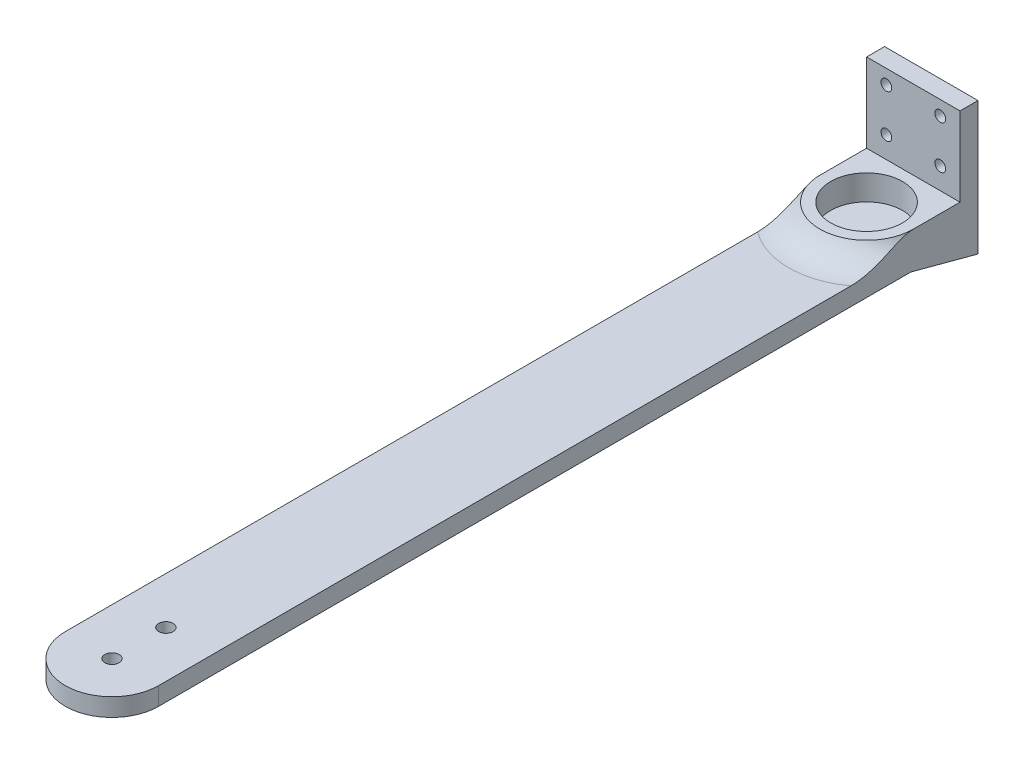
ISO-10303-21;
HEADER;
FILE_DESCRIPTION(('STEP AP214'),'2;1');
FILE_NAME('part.step','',(''),(''),'','','');
FILE_SCHEMA(('AUTOMOTIVE_DESIGN { 1 0 10303 214 1 1 1 1 }'));
ENDSEC;
DATA;
#1=APPLICATION_CONTEXT('core data for automotive mechanical design processes');
#2=APPLICATION_PROTOCOL_DEFINITION('international standard','automotive_design',2000,#1);
#3=PRODUCT_CONTEXT('',#1,'mechanical');
#4=PRODUCT('Part','Part','',(#3));
#5=PRODUCT_RELATED_PRODUCT_CATEGORY('part','',(#4));
#6=PRODUCT_DEFINITION_FORMATION('','',#4);
#7=PRODUCT_DEFINITION_CONTEXT('part definition',#1,'design');
#8=PRODUCT_DEFINITION('design','',#6,#7);
#9=PRODUCT_DEFINITION_SHAPE('','',#8);
#10=(LENGTH_UNIT() NAMED_UNIT(*) SI_UNIT(.MILLI.,.METRE.));
#11=(NAMED_UNIT(*) PLANE_ANGLE_UNIT() SI_UNIT($,.RADIAN.));
#12=(NAMED_UNIT(*) SI_UNIT($,.STERADIAN.) SOLID_ANGLE_UNIT());
#13=UNCERTAINTY_MEASURE_WITH_UNIT(LENGTH_MEASURE(1.E-05),#10,'distance_accuracy_value','');
#14=(GEOMETRIC_REPRESENTATION_CONTEXT(3) GLOBAL_UNCERTAINTY_ASSIGNED_CONTEXT((#13)) GLOBAL_UNIT_ASSIGNED_CONTEXT((#10,
#11,#12)) REPRESENTATION_CONTEXT('',''));
#15=CARTESIAN_POINT('',(0.,0.,0.));
#16=DIRECTION('',(0.,0.,1.));
#17=DIRECTION('',(1.,0.,0.));
#18=AXIS2_PLACEMENT_3D('',#15,#16,#17);
#19=CARTESIAN_POINT('',(0.,0.,0.));
#20=DIRECTION('',(0.,1.,0.));
#21=DIRECTION('',(0.,0.,1.));
#22=AXIS2_PLACEMENT_3D('',#19,#20,#21);
#23=PLANE('',#22);
#24=CARTESIAN_POINT('',(0.,0.,210.));
#25=DIRECTION('',(0.,-1.,0.));
#26=DIRECTION('',(0.,0.,-1.));
#27=AXIS2_PLACEMENT_3D('',#24,#25,#26);
#28=CIRCLE('',#27,2.);
#29=CARTESIAN_POINT('',(0.,0.,208.));
#30=VERTEX_POINT('',#29);
#31=EDGE_CURVE('E186',#30,#30,#28,.T.);
#32=ORIENTED_EDGE('',*,*,#31,.F.);
#33=EDGE_LOOP('',(#32));
#34=FACE_BOUND('',#33,.T.);
#35=CARTESIAN_POINT('',(0.,0.,195.));
#36=DIRECTION('',(0.,-1.,0.));
#37=DIRECTION('',(0.,0.,-1.));
#38=AXIS2_PLACEMENT_3D('',#35,#36,#37);
#39=CIRCLE('',#38,2.);
#40=CARTESIAN_POINT('',(0.,0.,193.));
#41=VERTEX_POINT('',#40);
#42=EDGE_CURVE('E167',#41,#41,#39,.T.);
#43=ORIENTED_EDGE('',*,*,#42,.F.);
#44=EDGE_LOOP('',(#43));
#45=FACE_BOUND('',#44,.T.);
#46=DIRECTION('',(-1.,0.,0.));
#47=VECTOR('',#46,1.);
#48=CARTESIAN_POINT('',(32.3185165257813,0.,0.66025403784432));
#49=LINE('',#48,#47);
#50=CARTESIAN_POINT('',(13.,0.,0.66025403784432));
#51=VERTEX_POINT('',#50);
#52=CARTESIAN_POINT('',(-13.,0.,0.66025403784432));
#53=VERTEX_POINT('',#52);
#54=EDGE_CURVE('E68',#51,#53,#49,.T.);
#55=ORIENTED_EDGE('',*,*,#54,.F.);
#56=DIRECTION('',(0.,0.,1.));
#57=VECTOR('',#56,1.);
#58=CARTESIAN_POINT('',(13.,0.,0.));
#59=LINE('',#58,#57);
#60=CARTESIAN_POINT('',(13.,0.,210.));
#61=VERTEX_POINT('',#60);
#62=EDGE_CURVE('E137',#51,#61,#59,.T.);
#63=ORIENTED_EDGE('',*,*,#62,.T.);
#64=CARTESIAN_POINT('',(0.,0.,210.));
#65=DIRECTION('',(0.,-1.,0.));
#66=DIRECTION('',(0.,0.,-1.));
#67=AXIS2_PLACEMENT_3D('',#64,#65,#66);
#68=CIRCLE('',#67,13.);
#69=CARTESIAN_POINT('',(-13.,0.,210.));
#70=VERTEX_POINT('',#69);
#71=EDGE_CURVE('E195',#70,#61,#68,.F.);
#72=ORIENTED_EDGE('',*,*,#71,.F.);
#73=DIRECTION('',(0.,0.,1.));
#74=VECTOR('',#73,1.);
#75=CARTESIAN_POINT('',(-13.,0.,0.));
#76=LINE('',#75,#74);
#77=EDGE_CURVE('E194',#53,#70,#76,.T.);
#78=ORIENTED_EDGE('',*,*,#77,.F.);
#79=EDGE_LOOP('',(#55,#63,#72,#78));
#80=FACE_BOUND('',#79,.T.);
#81=ADVANCED_FACE('F50',(#34,#45,#80),#23,.F.);
#82=CARTESIAN_POINT('',(0.,10.,0.));
#83=DIRECTION('',(0.,-1.,0.));
#84=DIRECTION('',(0.,0.,-1.));
#85=AXIS2_PLACEMENT_3D('',#82,#83,#84);
#86=CYLINDRICAL_SURFACE('',#85,10.);
#87=CARTESIAN_POINT('',(0.,3.,0.));
#88=DIRECTION('',(0.,1.,0.));
#89=DIRECTION('',(0.,0.,1.));
#90=AXIS2_PLACEMENT_3D('',#87,#88,#89);
#91=CIRCLE('',#90,10.);
#92=CARTESIAN_POINT('',(0.,3.,10.));
#93=VERTEX_POINT('',#92);
#94=EDGE_CURVE('E210',#93,#93,#91,.T.);
#95=ORIENTED_EDGE('',*,*,#94,.F.);
#96=EDGE_LOOP('',(#95));
#97=FACE_BOUND('',#96,.T.);
#98=CARTESIAN_POINT('',(0.,10.,0.));
#99=DIRECTION('',(0.,1.,0.));
#100=DIRECTION('',(0.,0.,1.));
#101=AXIS2_PLACEMENT_3D('',#98,#99,#100);
#102=CIRCLE('',#101,10.);
#103=CARTESIAN_POINT('',(0.,10.,10.));
#104=VERTEX_POINT('',#103);
#105=EDGE_CURVE('E204',#104,#104,#102,.T.);
#106=ORIENTED_EDGE('',*,*,#105,.T.);
#107=EDGE_LOOP('',(#106));
#108=FACE_BOUND('',#107,.T.);
#109=ADVANCED_FACE('F243',(#97,#108),#86,.F.);
#110=CARTESIAN_POINT('',(0.,10.,0.));
#111=DIRECTION('',(0.,1.,0.));
#112=DIRECTION('',(0.,0.,1.));
#113=AXIS2_PLACEMENT_3D('',#110,#111,#112);
#114=PLANE('',#113);
#115=CARTESIAN_POINT('',(0.,10.,0.));
#116=DIRECTION('',(0.,1.,0.));
#117=DIRECTION('',(0.,0.,1.));
#118=AXIS2_PLACEMENT_3D('',#115,#116,#117);
#119=CIRCLE('',#118,13.);
#120=CARTESIAN_POINT('',(-13.,10.,0.));
#121=VERTEX_POINT('',#120);
#122=CARTESIAN_POINT('',(13.,10.,0.));
#123=VERTEX_POINT('',#122);
#124=EDGE_CURVE('E199',#121,#123,#119,.T.);
#125=ORIENTED_EDGE('',*,*,#124,.T.);
#126=DIRECTION('',(0.,0.,-1.));
#127=VECTOR('',#126,1.);
#128=CARTESIAN_POINT('',(13.,10.,223.001));
#129=LINE('',#128,#127);
#130=CARTESIAN_POINT('',(13.,10.,-13.));
#131=VERTEX_POINT('',#130);
#132=EDGE_CURVE('E170',#123,#131,#129,.T.);
#133=ORIENTED_EDGE('',*,*,#132,.T.);
#134=DIRECTION('',(-1.,0.,0.));
#135=VECTOR('',#134,1.);
#136=CARTESIAN_POINT('',(13.,10.,-13.));
#137=LINE('',#136,#135);
#138=CARTESIAN_POINT('',(-13.,10.,-13.));
#139=VERTEX_POINT('',#138);
#140=EDGE_CURVE('E166',#131,#139,#137,.T.);
#141=ORIENTED_EDGE('',*,*,#140,.T.);
#142=DIRECTION('',(0.,0.,-1.));
#143=VECTOR('',#142,1.);
#144=CARTESIAN_POINT('',(-13.,10.,223.001));
#145=LINE('',#144,#143);
#146=EDGE_CURVE('E151',#121,#139,#145,.T.);
#147=ORIENTED_EDGE('',*,*,#146,.F.);
#148=EDGE_LOOP('',(#125,#133,#141,#147));
#149=FACE_BOUND('',#148,.T.);
#150=ORIENTED_EDGE('',*,*,#105,.F.);
#151=EDGE_LOOP('',(#150));
#152=FACE_BOUND('',#151,.T.);
#153=ADVANCED_FACE('F237',(#149,#152),#114,.T.);
#154=CARTESIAN_POINT('',(0.,3.,0.));
#155=DIRECTION('',(0.,1.,0.));
#156=DIRECTION('',(0.,0.,1.));
#157=AXIS2_PLACEMENT_3D('',#154,#155,#156);
#158=PLANE('',#157);
#159=ORIENTED_EDGE('',*,*,#94,.T.);
#160=EDGE_LOOP('',(#159));
#161=FACE_BOUND('',#160,.T.);
#162=ADVANCED_FACE('F226',(#161),#158,.T.);
#163=CARTESIAN_POINT('',(0.,5.,210.));
#164=DIRECTION('',(0.,-1.,0.));
#165=DIRECTION('',(0.,0.,-1.));
#166=AXIS2_PLACEMENT_3D('',#163,#164,#165);
#167=CYLINDRICAL_SURFACE('',#166,13.);
#168=ORIENTED_EDGE('',*,*,#71,.T.);
#169=DIRECTION('',(0.,-1.,0.));
#170=VECTOR('',#169,1.);
#171=CARTESIAN_POINT('',(13.,5.,210.));
#172=LINE('',#171,#170);
#173=CARTESIAN_POINT('',(13.,5.,210.));
#174=VERTEX_POINT('',#173);
#175=EDGE_CURVE('E198',#174,#61,#172,.T.);
#176=ORIENTED_EDGE('',*,*,#175,.F.);
#177=CARTESIAN_POINT('',(0.,5.,210.));
#178=DIRECTION('',(0.,-1.,0.));
#179=DIRECTION('',(0.,0.,-1.));
#180=AXIS2_PLACEMENT_3D('',#177,#178,#179);
#181=CIRCLE('',#180,13.);
#182=CARTESIAN_POINT('',(-13.,5.,210.));
#183=VERTEX_POINT('',#182);
#184=EDGE_CURVE('E177',#183,#174,#181,.F.);
#185=ORIENTED_EDGE('',*,*,#184,.F.);
#186=DIRECTION('',(0.,-1.,0.));
#187=VECTOR('',#186,1.);
#188=CARTESIAN_POINT('',(-13.,5.,210.));
#189=LINE('',#188,#187);
#190=EDGE_CURVE('E187',#183,#70,#189,.T.);
#191=ORIENTED_EDGE('',*,*,#190,.T.);
#192=EDGE_LOOP('',(#168,#176,#185,#191));
#193=FACE_BOUND('',#192,.T.);
#194=ADVANCED_FACE('F222',(#193),#167,.T.);
#195=CARTESIAN_POINT('',(13.,5.,0.));
#196=DIRECTION('',(1.,0.,0.));
#197=DIRECTION('',(0.,0.,-1.));
#198=AXIS2_PLACEMENT_3D('',#195,#196,#197);
#199=PLANE('',#198);
#200=ORIENTED_EDGE('',*,*,#62,.F.);
#201=DIRECTION('',(0.,0.258819045102522,0.965925826289068));
#202=VECTOR('',#201,1.);
#203=CARTESIAN_POINT('',(13.,-5.,-18.));
#204=LINE('',#203,#202);
#205=CARTESIAN_POINT('',(13.,-5.,-18.));
#206=VERTEX_POINT('',#205);
#207=EDGE_CURVE('E140',#206,#51,#204,.T.);
#208=ORIENTED_EDGE('',*,*,#207,.F.);
#209=DIRECTION('',(0.,-1.,0.));
#210=VECTOR('',#209,1.);
#211=CARTESIAN_POINT('',(13.,0.,-18.));
#212=LINE('',#211,#210);
#213=CARTESIAN_POINT('',(13.,32.,-18.));
#214=VERTEX_POINT('',#213);
#215=EDGE_CURVE('E124',#214,#206,#212,.T.);
#216=ORIENTED_EDGE('',*,*,#215,.F.);
#217=DIRECTION('',(0.,0.,1.));
#218=VECTOR('',#217,1.);
#219=CARTESIAN_POINT('',(13.,32.,-18.));
#220=LINE('',#219,#218);
#221=CARTESIAN_POINT('',(13.,32.,-13.));
#222=VERTEX_POINT('',#221);
#223=EDGE_CURVE('E132',#214,#222,#220,.T.);
#224=ORIENTED_EDGE('',*,*,#223,.T.);
#225=DIRECTION('',(0.,-1.,0.));
#226=VECTOR('',#225,1.);
#227=CARTESIAN_POINT('',(13.,0.,-13.));
#228=LINE('',#227,#226);
#229=EDGE_CURVE('E158',#222,#131,#228,.T.);
#230=ORIENTED_EDGE('',*,*,#229,.T.);
#231=ORIENTED_EDGE('',*,*,#132,.F.);
#232=CARTESIAN_POINT('',(13.,10.,0.));
#233=CARTESIAN_POINT('',(13.,10.0000056019238,0.0896543509538901));
#234=CARTESIAN_POINT('',(13.,9.99839286840601,0.179300659693812));
#235=CARTESIAN_POINT('',(13.,9.99198153676725,0.358470745976763));
#236=CARTESIAN_POINT('',(13.,9.98718325147842,0.447994534686714));
#237=CARTESIAN_POINT('',(13.,9.96810306155521,0.716006153465018));
#238=CARTESIAN_POINT('',(13.,9.94913555159317,0.89417812995479));
#239=CARTESIAN_POINT('',(13.,9.89993574508726,1.24703368869215));
#240=CARTESIAN_POINT('',(13.,9.86982232068042,1.42173428523119));
#241=CARTESIAN_POINT('',(13.,9.79966665096586,1.76916307890243));
#242=CARTESIAN_POINT('',(13.,9.75962139468372,1.94189066124571));
#243=CARTESIAN_POINT('',(13.,9.67114674603718,2.2851000656238));
#244=CARTESIAN_POINT('',(13.,9.62272002349056,2.45558258424519));
#245=CARTESIAN_POINT('',(13.,9.51898545195341,2.79441174070556));
#246=CARTESIAN_POINT('',(13.,9.46367794134916,2.96275848313031));
#247=CARTESIAN_POINT('',(13.,9.34734907713014,3.29816517676183));
#248=CARTESIAN_POINT('',(13.,9.28630687786827,3.46521784032122));
#249=CARTESIAN_POINT('',(13.,9.15992379563443,3.79766977095107));
#250=CARTESIAN_POINT('',(13.,9.09458309478465,3.96306910772934));
#251=CARTESIAN_POINT('',(13.,8.91970451683082,4.39337581793867));
#252=CARTESIAN_POINT('',(13.,8.80759145495182,4.65723128559471));
#253=CARTESIAN_POINT('',(13.,8.57864025012165,5.18289258169075));
#254=CARTESIAN_POINT('',(13.,8.46180151704577,5.44469814924396));
#255=CARTESIAN_POINT('',(13.,8.22618069776955,5.96753807011292));
#256=CARTESIAN_POINT('',(13.,8.10739795015014,6.22857212370811));
#257=CARTESIAN_POINT('',(13.,7.87018598281517,6.75078523519494));
#258=CARTESIAN_POINT('',(13.,7.7517567453596,7.01196428500284));
#259=CARTESIAN_POINT('',(13.,7.51763801680784,7.53410267287928));
#260=CARTESIAN_POINT('',(13.,7.40193838375753,7.79505743511656));
#261=CARTESIAN_POINT('',(13.,7.17427119116873,8.31859961060457));
#262=CARTESIAN_POINT('',(13.,7.06230366297831,8.58118703754699));
#263=CARTESIAN_POINT('',(13.,6.84347058344136,9.10850455587691));
#264=CARTESIAN_POINT('',(13.,6.73660523276951,9.37323473106309));
#265=CARTESIAN_POINT('',(13.,6.52923074056898,9.90517087318102));
#266=CARTESIAN_POINT('',(13.,6.42872161762033,10.1723768473472));
#267=CARTESIAN_POINT('',(13.,6.13551044473197,10.9863594340849));
#268=CARTESIAN_POINT('',(13.,5.95454543989271,11.5374601927441));
#269=CARTESIAN_POINT('',(13.,5.63285274538641,12.6511146702757));
#270=CARTESIAN_POINT('',(13.,5.49209516782712,13.2136595472762));
#271=CARTESIAN_POINT('',(13.,5.31592878251318,14.0720854299519));
#272=CARTESIAN_POINT('',(13.,5.26260692965661,14.3643385340628));
#273=CARTESIAN_POINT('',(13.,5.16982240181715,14.9510292891363));
#274=CARTESIAN_POINT('',(13.,5.13035814478151,15.2454666868074));
#275=CARTESIAN_POINT('',(13.,5.06625451302861,15.8369470451726));
#276=CARTESIAN_POINT('',(13.,5.04166411309216,16.133995381061));
#277=CARTESIAN_POINT('',(13.,5.0085284866831,16.7291144349595));
#278=CARTESIAN_POINT('',(13.,4.99999067592787,17.027185561795));
#279=CARTESIAN_POINT('',(13.,5.,17.3253168797559));
#280=B_SPLINE_CURVE_WITH_KNOTS('',3,(#232,#233,#234,#235,#236,#237,#238,#239,#240,#241,#242,
#243,#244,#245,#246,#247,#248,#249,#250,#251,#252,#253,#254,#255,#256,#257,#258,#259,#260,#261,
#262,#263,#264,#265,#266,#267,#268,#269,#270,#271,#272,#273,#274,#275,#276,#277,#278,#279),
.UNSPECIFIED.,.F.,.F.,(4,2,2,2,2,2,2,2,2,2,2,2,2,2,2,2,2,2,2,2,2,2,2,4),(0.,0.26893317208374,
0.537839937907302,1.07492345709711,1.60643665576927,2.13811118752676,2.66961667125123,
3.2010960267002,3.73458814556347,4.26805767556552,5.12801830534511,5.98808665747486,
6.84845398166465,7.7087773791334,8.56511973859628,9.42146928915171,10.2778524932503,
11.1342382005472,12.8731903009987,14.6108463803658,15.5018008230113,16.392653516726,
17.2864237537457,18.180606779037),.UNSPECIFIED.);
#281=CARTESIAN_POINT('',(13.,5.,17.3253168797559));
#282=VERTEX_POINT('',#281);
#283=EDGE_CURVE('E11',#123,#282,#280,.T.);
#284=ORIENTED_EDGE('',*,*,#283,.T.);
#285=DIRECTION('',(0.,0.,1.));
#286=VECTOR('',#285,1.);
#287=CARTESIAN_POINT('',(13.,5.,0.));
#288=LINE('',#287,#286);
#289=EDGE_CURVE('E183',#282,#174,#288,.T.);
#290=ORIENTED_EDGE('',*,*,#289,.T.);
#291=ORIENTED_EDGE('',*,*,#175,.T.);
#292=EDGE_LOOP('',(#200,#208,#216,#224,#230,#231,#284,#290,#291));
#293=FACE_BOUND('',#292,.T.);
#294=ADVANCED_FACE('F136',(#293),#199,.T.);
#295=CARTESIAN_POINT('',(0.,5.,210.));
#296=DIRECTION('',(0.,-1.,0.));
#297=DIRECTION('',(0.,0.,-1.));
#298=AXIS2_PLACEMENT_3D('',#295,#296,#297);
#299=CYLINDRICAL_SURFACE('',#298,2.);
#300=CARTESIAN_POINT('',(0.,5.,210.));
#301=DIRECTION('',(0.,-1.,0.));
#302=DIRECTION('',(0.,0.,-1.));
#303=AXIS2_PLACEMENT_3D('',#300,#301,#302);
#304=CIRCLE('',#303,2.);
#305=CARTESIAN_POINT('',(0.,5.,208.));
#306=VERTEX_POINT('',#305);
#307=EDGE_CURVE('E176',#306,#306,#304,.T.);
#308=ORIENTED_EDGE('',*,*,#307,.F.);
#309=EDGE_LOOP('',(#308));
#310=FACE_BOUND('',#309,.T.);
#311=ORIENTED_EDGE('',*,*,#31,.T.);
#312=EDGE_LOOP('',(#311));
#313=FACE_BOUND('',#312,.T.);
#314=ADVANCED_FACE('F229',(#310,#313),#299,.F.);
#315=CARTESIAN_POINT('',(0.,5.,195.));
#316=DIRECTION('',(0.,-1.,0.));
#317=DIRECTION('',(0.,0.,-1.));
#318=AXIS2_PLACEMENT_3D('',#315,#316,#317);
#319=CYLINDRICAL_SURFACE('',#318,2.);
#320=CARTESIAN_POINT('',(0.,5.,195.));
#321=DIRECTION('',(0.,-1.,0.));
#322=DIRECTION('',(0.,0.,-1.));
#323=AXIS2_PLACEMENT_3D('',#320,#321,#322);
#324=CIRCLE('',#323,2.);
#325=CARTESIAN_POINT('',(0.,5.,193.));
#326=VERTEX_POINT('',#325);
#327=EDGE_CURVE('E173',#326,#326,#324,.T.);
#328=ORIENTED_EDGE('',*,*,#327,.F.);
#329=EDGE_LOOP('',(#328));
#330=FACE_BOUND('',#329,.T.);
#331=ORIENTED_EDGE('',*,*,#42,.T.);
#332=EDGE_LOOP('',(#331));
#333=FACE_BOUND('',#332,.T.);
#334=ADVANCED_FACE('F225',(#330,#333),#319,.F.);
#335=CARTESIAN_POINT('',(-13.,5.,0.));
#336=DIRECTION('',(1.,0.,0.));
#337=DIRECTION('',(0.,0.,-1.));
#338=AXIS2_PLACEMENT_3D('',#335,#336,#337);
#339=PLANE('',#338);
#340=DIRECTION('',(0.,1.,0.));
#341=VECTOR('',#340,1.);
#342=CARTESIAN_POINT('',(-13.,0.,-18.));
#343=LINE('',#342,#341);
#344=CARTESIAN_POINT('',(-13.,-5.,-18.));
#345=VERTEX_POINT('',#344);
#346=CARTESIAN_POINT('',(-13.,32.,-18.));
#347=VERTEX_POINT('',#346);
#348=EDGE_CURVE('E152',#345,#347,#343,.T.);
#349=ORIENTED_EDGE('',*,*,#348,.F.);
#350=DIRECTION('',(0.,0.258819045102522,0.965925826289068));
#351=VECTOR('',#350,1.);
#352=CARTESIAN_POINT('',(-13.,-5.,-18.));
#353=LINE('',#352,#351);
#354=EDGE_CURVE('E143',#345,#53,#353,.T.);
#355=ORIENTED_EDGE('',*,*,#354,.T.);
#356=ORIENTED_EDGE('',*,*,#77,.T.);
#357=ORIENTED_EDGE('',*,*,#190,.F.);
#358=DIRECTION('',(0.,0.,1.));
#359=VECTOR('',#358,1.);
#360=CARTESIAN_POINT('',(-13.,5.,0.));
#361=LINE('',#360,#359);
#362=CARTESIAN_POINT('',(-13.,5.,17.3253168797559));
#363=VERTEX_POINT('',#362);
#364=EDGE_CURVE('E185',#363,#183,#361,.T.);
#365=ORIENTED_EDGE('',*,*,#364,.F.);
#366=CARTESIAN_POINT('',(-13.,5.,17.3253168797559));
#367=CARTESIAN_POINT('',(-13.,4.99999808472166,17.0617570442487));
#368=CARTESIAN_POINT('',(-13.,5.00666666113705,16.7982596926096));
#369=CARTESIAN_POINT('',(-13.,5.03264838028017,16.2719699810068));
#370=CARTESIAN_POINT('',(-13.,5.05195739579854,16.0091774190351));
#371=CARTESIAN_POINT('',(-13.,5.12776036151508,15.2229625738943));
#372=CARTESIAN_POINT('',(-13.,5.2021328636717,14.7012046205128));
#373=CARTESIAN_POINT('',(-13.,5.39207180273353,13.6683724712777));
#374=CARTESIAN_POINT('',(-13.,5.5074128892152,13.1572557094616));
#375=CARTESIAN_POINT('',(-13.,5.70666604558134,12.3976979507014));
#376=CARTESIAN_POINT('',(-13.,5.77745104627786,12.1457169327012));
#377=CARTESIAN_POINT('',(-13.,5.92697849921975,11.6441080927741));
#378=CARTESIAN_POINT('',(-13.,6.00572142908554,11.3944804130746));
#379=CARTESIAN_POINT('',(-13.,6.24165449312309,10.6823684677556));
#380=CARTESIAN_POINT('',(-13.,6.40771123524949,10.2228167677706));
#381=CARTESIAN_POINT('',(-13.,6.7590206069845,9.31126073582023));
#382=CARTESIAN_POINT('',(-13.,6.94427214598563,8.85925597674625));
#383=CARTESIAN_POINT('',(-13.,7.23175121028479,8.18542251157113));
#384=CARTESIAN_POINT('',(-13.,7.32917432115919,7.96151464289714));
#385=CARTESIAN_POINT('',(-13.,7.52630371746693,7.51470433950355));
#386=CARTESIAN_POINT('',(-13.,7.62601001854083,7.29180191168406));
#387=CARTESIAN_POINT('',(-13.,7.82679410264957,6.84632463306985));
#388=CARTESIAN_POINT('',(-13.,7.92787327154435,6.62375041081371));
#389=CARTESIAN_POINT('',(-13.,8.1301104057352,6.17863259412965));
#390=CARTESIAN_POINT('',(-13.,8.23126837250144,5.95608900036898));
#391=CARTESIAN_POINT('',(-13.,8.43423940259312,5.50600256119958));
#392=CARTESIAN_POINT('',(-13.,8.5360260104624,5.27844771353033));
#393=CARTESIAN_POINT('',(-13.,8.73640255132931,4.82193771836915));
#394=CARTESIAN_POINT('',(-13.,8.83499264881999,4.5929826436562));
#395=CARTESIAN_POINT('',(-13.,9.02639559015043,4.13359629544238));
#396=CARTESIAN_POINT('',(-13.,9.11922758825968,3.90317307926782));
#397=CARTESIAN_POINT('',(-13.,9.29673346732544,3.43909492273006));
#398=CARTESIAN_POINT('',(-13.,9.38140523185654,3.20543916185192));
#399=CARTESIAN_POINT('',(-13.,9.53990766819959,2.7318689304275));
#400=CARTESIAN_POINT('',(-13.,9.61362367901181,2.49191552648382));
#401=CARTESIAN_POINT('',(-13.,9.74498695998871,2.00775849547569));
#402=CARTESIAN_POINT('',(-13.,9.80264939166694,1.7635591116737));
#403=CARTESIAN_POINT('',(-13.,9.87422546823825,1.39268664135691));
#404=CARTESIAN_POINT('',(-13.,9.89568927462526,1.26745552582971));
#405=CARTESIAN_POINT('',(-13.,9.93291460626839,1.01614822452363));
#406=CARTESIAN_POINT('',(-13.,9.94867659695251,0.890072108576543));
#407=CARTESIAN_POINT('',(-13.,9.97412942817595,0.636852357775103));
#408=CARTESIAN_POINT('',(-13.,9.98379856004715,0.509706523295278));
#409=CARTESIAN_POINT('',(-13.,9.9967505281899,0.255044218984917));
#410=CARTESIAN_POINT('',(-13.,10.0000309807928,0.127527628586927));
#411=CARTESIAN_POINT('',(-13.,9.99999999999998,0.));
#412=B_SPLINE_CURVE_WITH_KNOTS('',3,(#366,#367,#368,#369,#370,#371,#372,#373,#374,#375,#376,
#377,#378,#379,#380,#381,#382,#383,#384,#385,#386,#387,#388,#389,#390,#391,#392,#393,#394,#395,
#396,#397,#398,#399,#400,#401,#402,#403,#404,#405,#406,#407,#408,#409,#410,#411),.UNSPECIFIED.,
.F.,.F.,(4,2,2,2,2,2,2,2,2,2,2,2,2,2,2,2,2,2,2,2,2,2,4),(0.,0.790489495569375,1.58072101833403,
3.15969446602515,4.73011384383497,5.51520553026805,6.30034436449007,7.76561580064061,
9.23080402879243,9.96334745837973,10.695895907618,11.429248808871,12.1626157371087,
12.9104525346885,13.6582507871594,14.4034109180194,15.1487637952592,15.9014382055543,
16.653399335843,17.0344605713666,17.415490694588,17.7978708522317,18.1803936517354),.UNSPECIFIED.);
#413=EDGE_CURVE('E61',#363,#121,#412,.T.);
#414=ORIENTED_EDGE('',*,*,#413,.T.);
#415=ORIENTED_EDGE('',*,*,#146,.T.);
#416=DIRECTION('',(0.,1.,0.));
#417=VECTOR('',#416,1.);
#418=CARTESIAN_POINT('',(-13.,0.,-13.));
#419=LINE('',#418,#417);
#420=CARTESIAN_POINT('',(-13.,32.,-13.));
#421=VERTEX_POINT('',#420);
#422=EDGE_CURVE('E153',#139,#421,#419,.T.);
#423=ORIENTED_EDGE('',*,*,#422,.T.);
#424=DIRECTION('',(0.,0.,1.));
#425=VECTOR('',#424,1.);
#426=CARTESIAN_POINT('',(-13.,32.,-18.));
#427=LINE('',#426,#425);
#428=EDGE_CURVE('E165',#347,#421,#427,.T.);
#429=ORIENTED_EDGE('',*,*,#428,.F.);
#430=EDGE_LOOP('',(#349,#355,#356,#357,#365,#414,#415,#423,#429));
#431=FACE_BOUND('',#430,.T.);
#432=ADVANCED_FACE('F220',(#431),#339,.F.);
#433=CARTESIAN_POINT('',(0.,5.,0.));
#434=DIRECTION('',(0.,-1.,0.));
#435=DIRECTION('',(0.,0.,-1.));
#436=AXIS2_PLACEMENT_3D('',#433,#434,#435);
#437=PLANE('',#436);
#438=ORIENTED_EDGE('',*,*,#327,.T.);
#439=EDGE_LOOP('',(#438));
#440=FACE_BOUND('',#439,.T.);
#441=ORIENTED_EDGE('',*,*,#307,.T.);
#442=EDGE_LOOP('',(#441));
#443=FACE_BOUND('',#442,.T.);
#444=ORIENTED_EDGE('',*,*,#289,.F.);
#445=CARTESIAN_POINT('',(0.,5.,0.));
#446=DIRECTION('',(0.,-1.,0.));
#447=DIRECTION('',(0.,0.,-1.));
#448=AXIS2_PLACEMENT_3D('',#445,#446,#447);
#449=CIRCLE('',#448,21.6602540378444);
#450=EDGE_CURVE('E208',#282,#363,#449,.T.);
#451=ORIENTED_EDGE('',*,*,#450,.T.);
#452=ORIENTED_EDGE('',*,*,#364,.T.);
#453=ORIENTED_EDGE('',*,*,#184,.T.);
#454=EDGE_LOOP('',(#444,#451,#452,#453));
#455=FACE_BOUND('',#454,.T.);
#456=ADVANCED_FACE('F223',(#440,#443,#455),#437,.F.);
#457=CARTESIAN_POINT('',(0.,15.,0.));
#458=DIRECTION('',(0.,-1.,0.));
#459=DIRECTION('',(0.,0.,-1.));
#460=AXIS2_PLACEMENT_3D('',#457,#458,#459);
#461=TOROIDAL_SURFACE('',#460,21.6602540378444,10.);
#462=ORIENTED_EDGE('',*,*,#283,.F.);
#463=ORIENTED_EDGE('',*,*,#124,.F.);
#464=ORIENTED_EDGE('',*,*,#413,.F.);
#465=ORIENTED_EDGE('',*,*,#450,.F.);
#466=EDGE_LOOP('',(#462,#463,#464,#465));
#467=FACE_BOUND('',#466,.T.);
#468=ADVANCED_FACE('F47',(#467),#461,.F.);
#469=CARTESIAN_POINT('',(13.,32.,-18.));
#470=DIRECTION('',(0.,-1.,0.));
#471=DIRECTION('',(0.,0.,-1.));
#472=AXIS2_PLACEMENT_3D('',#469,#470,#471);
#473=PLANE('',#472);
#474=DIRECTION('',(1.,0.,0.));
#475=VECTOR('',#474,1.);
#476=CARTESIAN_POINT('',(13.,32.,-13.));
#477=LINE('',#476,#475);
#478=EDGE_CURVE('E159',#421,#222,#477,.T.);
#479=ORIENTED_EDGE('',*,*,#478,.T.);
#480=ORIENTED_EDGE('',*,*,#223,.F.);
#481=DIRECTION('',(1.,0.,0.));
#482=VECTOR('',#481,1.);
#483=CARTESIAN_POINT('',(13.,32.,-18.));
#484=LINE('',#483,#482);
#485=EDGE_CURVE('E129',#347,#214,#484,.T.);
#486=ORIENTED_EDGE('',*,*,#485,.F.);
#487=ORIENTED_EDGE('',*,*,#428,.T.);
#488=EDGE_LOOP('',(#479,#480,#486,#487));
#489=FACE_BOUND('',#488,.T.);
#490=ADVANCED_FACE('F299',(#489),#473,.F.);
#491=CARTESIAN_POINT('',(0.,0.,-18.));
#492=DIRECTION('',(0.,0.,1.));
#493=DIRECTION('',(1.,0.,0.));
#494=AXIS2_PLACEMENT_3D('',#491,#492,#493);
#495=PLANE('',#494);
#496=CARTESIAN_POINT('',(-7.5,16.,-18.));
#497=DIRECTION('',(0.,0.,1.));
#498=DIRECTION('',(1.,0.,0.));
#499=AXIS2_PLACEMENT_3D('',#496,#497,#498);
#500=CIRCLE('',#499,1.5);
#501=CARTESIAN_POINT('',(-6.,16.,-18.));
#502=VERTEX_POINT('',#501);
#503=EDGE_CURVE('E391',#502,#502,#500,.T.);
#504=ORIENTED_EDGE('',*,*,#503,.T.);
#505=EDGE_LOOP('',(#504));
#506=FACE_BOUND('',#505,.T.);
#507=CARTESIAN_POINT('',(7.5,16.,-18.));
#508=DIRECTION('',(0.,0.,1.));
#509=DIRECTION('',(1.,0.,0.));
#510=AXIS2_PLACEMENT_3D('',#507,#508,#509);
#511=CIRCLE('',#510,1.5);
#512=CARTESIAN_POINT('',(9.,16.,-18.));
#513=VERTEX_POINT('',#512);
#514=EDGE_CURVE('E394',#513,#513,#511,.T.);
#515=ORIENTED_EDGE('',*,*,#514,.T.);
#516=EDGE_LOOP('',(#515));
#517=FACE_BOUND('',#516,.T.);
#518=CARTESIAN_POINT('',(7.5,28.,-18.));
#519=DIRECTION('',(0.,0.,1.));
#520=DIRECTION('',(1.,0.,0.));
#521=AXIS2_PLACEMENT_3D('',#518,#519,#520);
#522=CIRCLE('',#521,1.5);
#523=CARTESIAN_POINT('',(9.,28.,-18.));
#524=VERTEX_POINT('',#523);
#525=EDGE_CURVE('E411',#524,#524,#522,.T.);
#526=ORIENTED_EDGE('',*,*,#525,.T.);
#527=EDGE_LOOP('',(#526));
#528=FACE_BOUND('',#527,.T.);
#529=CARTESIAN_POINT('',(-7.5,28.,-18.));
#530=DIRECTION('',(0.,0.,1.));
#531=DIRECTION('',(1.,0.,0.));
#532=AXIS2_PLACEMENT_3D('',#529,#530,#531);
#533=CIRCLE('',#532,1.5);
#534=CARTESIAN_POINT('',(-6.,28.,-18.));
#535=VERTEX_POINT('',#534);
#536=EDGE_CURVE('E150',#535,#535,#533,.T.);
#537=ORIENTED_EDGE('',*,*,#536,.T.);
#538=EDGE_LOOP('',(#537));
#539=FACE_BOUND('',#538,.T.);
#540=ORIENTED_EDGE('',*,*,#348,.T.);
#541=ORIENTED_EDGE('',*,*,#485,.T.);
#542=ORIENTED_EDGE('',*,*,#215,.T.);
#543=DIRECTION('',(-1.,0.,0.));
#544=VECTOR('',#543,1.);
#545=CARTESIAN_POINT('',(32.3185165257813,-5.,-18.));
#546=LINE('',#545,#544);
#547=EDGE_CURVE('E127',#206,#345,#546,.T.);
#548=ORIENTED_EDGE('',*,*,#547,.T.);
#549=EDGE_LOOP('',(#540,#541,#542,#548));
#550=FACE_BOUND('',#549,.T.);
#551=ADVANCED_FACE('F126',(#506,#517,#528,#539,#550),#495,.F.);
#552=CARTESIAN_POINT('',(0.,0.,-13.));
#553=DIRECTION('',(0.,0.,1.));
#554=DIRECTION('',(1.,0.,0.));
#555=AXIS2_PLACEMENT_3D('',#552,#553,#554);
#556=PLANE('',#555);
#557=CARTESIAN_POINT('',(-7.5,16.,-13.));
#558=DIRECTION('',(0.,0.,1.));
#559=DIRECTION('',(1.,0.,0.));
#560=AXIS2_PLACEMENT_3D('',#557,#558,#559);
#561=CIRCLE('',#560,1.5);
#562=CARTESIAN_POINT('',(-6.,16.,-13.));
#563=VERTEX_POINT('',#562);
#564=EDGE_CURVE('E392',#563,#563,#561,.T.);
#565=ORIENTED_EDGE('',*,*,#564,.F.);
#566=EDGE_LOOP('',(#565));
#567=FACE_BOUND('',#566,.T.);
#568=CARTESIAN_POINT('',(7.5,16.,-13.));
#569=DIRECTION('',(0.,0.,1.));
#570=DIRECTION('',(1.,0.,0.));
#571=AXIS2_PLACEMENT_3D('',#568,#569,#570);
#572=CIRCLE('',#571,1.5);
#573=CARTESIAN_POINT('',(9.,16.,-13.));
#574=VERTEX_POINT('',#573);
#575=EDGE_CURVE('E396',#574,#574,#572,.T.);
#576=ORIENTED_EDGE('',*,*,#575,.F.);
#577=EDGE_LOOP('',(#576));
#578=FACE_BOUND('',#577,.T.);
#579=CARTESIAN_POINT('',(7.5,28.,-13.));
#580=DIRECTION('',(0.,0.,1.));
#581=DIRECTION('',(1.,0.,0.));
#582=AXIS2_PLACEMENT_3D('',#579,#580,#581);
#583=CIRCLE('',#582,1.5);
#584=CARTESIAN_POINT('',(9.,28.,-13.));
#585=VERTEX_POINT('',#584);
#586=EDGE_CURVE('E410',#585,#585,#583,.T.);
#587=ORIENTED_EDGE('',*,*,#586,.F.);
#588=EDGE_LOOP('',(#587));
#589=FACE_BOUND('',#588,.T.);
#590=CARTESIAN_POINT('',(-7.5,28.,-13.));
#591=DIRECTION('',(0.,0.,1.));
#592=DIRECTION('',(1.,0.,0.));
#593=AXIS2_PLACEMENT_3D('',#590,#591,#592);
#594=CIRCLE('',#593,1.5);
#595=CARTESIAN_POINT('',(-6.,28.,-13.));
#596=VERTEX_POINT('',#595);
#597=EDGE_CURVE('E403',#596,#596,#594,.T.);
#598=ORIENTED_EDGE('',*,*,#597,.F.);
#599=EDGE_LOOP('',(#598));
#600=FACE_BOUND('',#599,.T.);
#601=ORIENTED_EDGE('',*,*,#422,.F.);
#602=ORIENTED_EDGE('',*,*,#140,.F.);
#603=ORIENTED_EDGE('',*,*,#229,.F.);
#604=ORIENTED_EDGE('',*,*,#478,.F.);
#605=EDGE_LOOP('',(#601,#602,#603,#604));
#606=FACE_BOUND('',#605,.T.);
#607=ADVANCED_FACE('F331',(#567,#578,#589,#600,#606),#556,.T.);
#608=CARTESIAN_POINT('',(32.3185165257813,-5.,-18.));
#609=DIRECTION('',(0.,-0.965925826289068,0.258819045102522));
#610=DIRECTION('',(0.,-0.258819045102522,-0.965925826289068));
#611=AXIS2_PLACEMENT_3D('',#608,#609,#610);
#612=PLANE('',#611);
#613=ORIENTED_EDGE('',*,*,#547,.F.);
#614=ORIENTED_EDGE('',*,*,#207,.T.);
#615=ORIENTED_EDGE('',*,*,#54,.T.);
#616=ORIENTED_EDGE('',*,*,#354,.F.);
#617=EDGE_LOOP('',(#613,#614,#615,#616));
#618=FACE_BOUND('',#617,.T.);
#619=ADVANCED_FACE('F141',(#618),#612,.T.);
#620=CARTESIAN_POINT('',(-7.5,28.,-18.));
#621=DIRECTION('',(0.,0.,1.));
#622=DIRECTION('',(1.,0.,0.));
#623=AXIS2_PLACEMENT_3D('',#620,#621,#622);
#624=CYLINDRICAL_SURFACE('',#623,1.5);
#625=ORIENTED_EDGE('',*,*,#536,.F.);
#626=EDGE_LOOP('',(#625));
#627=FACE_BOUND('',#626,.T.);
#628=ORIENTED_EDGE('',*,*,#597,.T.);
#629=EDGE_LOOP('',(#628));
#630=FACE_BOUND('',#629,.T.);
#631=ADVANCED_FACE('F335',(#627,#630),#624,.F.);
#632=CARTESIAN_POINT('',(7.5,28.,-18.));
#633=DIRECTION('',(0.,0.,1.));
#634=DIRECTION('',(1.,0.,0.));
#635=AXIS2_PLACEMENT_3D('',#632,#633,#634);
#636=CYLINDRICAL_SURFACE('',#635,1.5);
#637=ORIENTED_EDGE('',*,*,#525,.F.);
#638=EDGE_LOOP('',(#637));
#639=FACE_BOUND('',#638,.T.);
#640=ORIENTED_EDGE('',*,*,#586,.T.);
#641=EDGE_LOOP('',(#640));
#642=FACE_BOUND('',#641,.T.);
#643=ADVANCED_FACE('F355',(#639,#642),#636,.F.);
#644=CARTESIAN_POINT('',(7.5,16.,-18.));
#645=DIRECTION('',(0.,0.,1.));
#646=DIRECTION('',(1.,0.,0.));
#647=AXIS2_PLACEMENT_3D('',#644,#645,#646);
#648=CYLINDRICAL_SURFACE('',#647,1.5);
#649=ORIENTED_EDGE('',*,*,#514,.F.);
#650=EDGE_LOOP('',(#649));
#651=FACE_BOUND('',#650,.T.);
#652=ORIENTED_EDGE('',*,*,#575,.T.);
#653=EDGE_LOOP('',(#652));
#654=FACE_BOUND('',#653,.T.);
#655=ADVANCED_FACE('F363',(#651,#654),#648,.F.);
#656=CARTESIAN_POINT('',(-7.5,16.,-18.));
#657=DIRECTION('',(0.,0.,1.));
#658=DIRECTION('',(1.,0.,0.));
#659=AXIS2_PLACEMENT_3D('',#656,#657,#658);
#660=CYLINDRICAL_SURFACE('',#659,1.5);
#661=ORIENTED_EDGE('',*,*,#503,.F.);
#662=EDGE_LOOP('',(#661));
#663=FACE_BOUND('',#662,.T.);
#664=ORIENTED_EDGE('',*,*,#564,.T.);
#665=EDGE_LOOP('',(#664));
#666=FACE_BOUND('',#665,.T.);
#667=ADVANCED_FACE('F369',(#663,#666),#660,.F.);
#668=CLOSED_SHELL('',(#81,#109,#153,#162,#194,#294,#314,#334,#432,#456,#468,#490,#551,#607,#619,
#631,#643,#655,#667));
#669=MANIFOLD_SOLID_BREP('B2',#668);
#670=ADVANCED_BREP_SHAPE_REPRESENTATION('',(#18,#669),#14);
#671=SHAPE_DEFINITION_REPRESENTATION(#9,#670);
ENDSEC;
END-ISO-10303-21;
